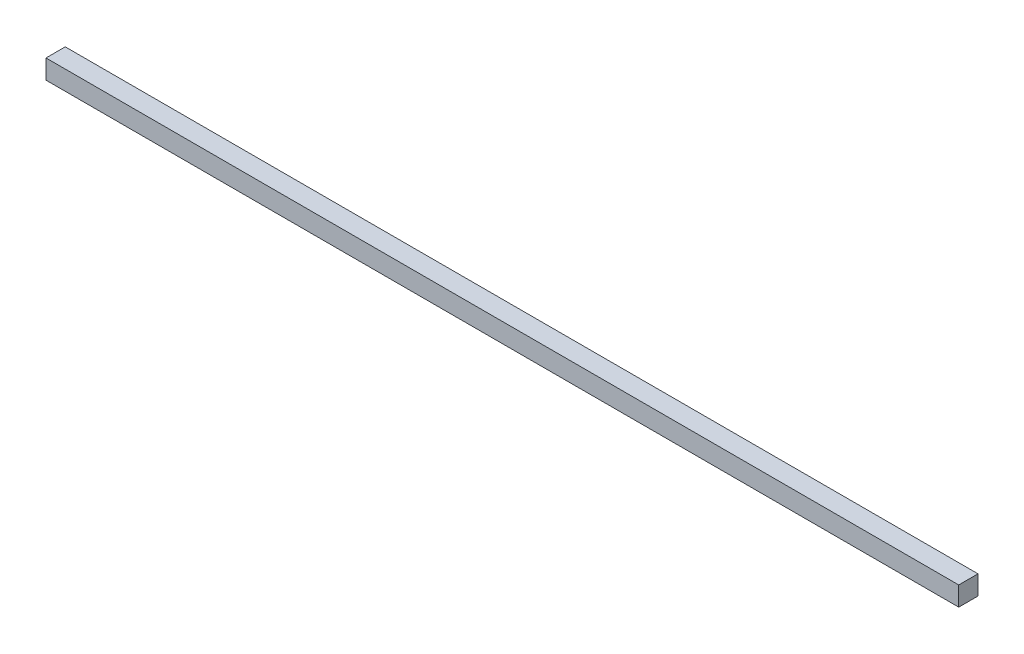
ISO-10303-21;
HEADER;
FILE_DESCRIPTION(('STEP AP214'),'2;1');
FILE_NAME('part.step','',(''),(''),'','','');
FILE_SCHEMA(('AUTOMOTIVE_DESIGN { 1 0 10303 214 1 1 1 1 }'));
ENDSEC;
DATA;
#1=APPLICATION_CONTEXT('core data for automotive mechanical design processes');
#2=APPLICATION_PROTOCOL_DEFINITION('international standard','automotive_design',2000,#1);
#3=PRODUCT_CONTEXT('',#1,'mechanical');
#4=PRODUCT('Part','Part','',(#3));
#5=PRODUCT_RELATED_PRODUCT_CATEGORY('part','',(#4));
#6=PRODUCT_DEFINITION_FORMATION('','',#4);
#7=PRODUCT_DEFINITION_CONTEXT('part definition',#1,'design');
#8=PRODUCT_DEFINITION('design','',#6,#7);
#9=PRODUCT_DEFINITION_SHAPE('','',#8);
#10=(LENGTH_UNIT() NAMED_UNIT(*) SI_UNIT(.MILLI.,.METRE.));
#11=(NAMED_UNIT(*) PLANE_ANGLE_UNIT() SI_UNIT($,.RADIAN.));
#12=(NAMED_UNIT(*) SI_UNIT($,.STERADIAN.) SOLID_ANGLE_UNIT());
#13=UNCERTAINTY_MEASURE_WITH_UNIT(LENGTH_MEASURE(1.E-05),#10,'distance_accuracy_value','');
#14=(GEOMETRIC_REPRESENTATION_CONTEXT(3) GLOBAL_UNCERTAINTY_ASSIGNED_CONTEXT((#13)) GLOBAL_UNIT_ASSIGNED_CONTEXT((#10,
#11,#12)) REPRESENTATION_CONTEXT('',''));
#15=CARTESIAN_POINT('',(0.,0.,0.));
#16=DIRECTION('',(0.,0.,1.));
#17=DIRECTION('',(1.,0.,0.));
#18=AXIS2_PLACEMENT_3D('',#15,#16,#17);
#19=CARTESIAN_POINT('',(150.495,3.175,3.175));
#20=DIRECTION('',(0.,0.,-1.));
#21=DIRECTION('',(0.,-1.,0.));
#22=AXIS2_PLACEMENT_3D('',#19,#20,#21);
#23=PLANE('',#22);
#24=DIRECTION('',(0.,1.,0.));
#25=VECTOR('',#24,1.);
#26=CARTESIAN_POINT('',(-150.495,3.175,3.175));
#27=LINE('',#26,#25);
#28=CARTESIAN_POINT('',(-150.495,-3.175,3.175));
#29=VERTEX_POINT('',#28);
#30=CARTESIAN_POINT('',(-150.495,3.175,3.175));
#31=VERTEX_POINT('',#30);
#32=EDGE_CURVE('E108',#29,#31,#27,.T.);
#33=ORIENTED_EDGE('',*,*,#32,.F.);
#34=DIRECTION('',(-1.,0.,0.));
#35=VECTOR('',#34,1.);
#36=CARTESIAN_POINT('',(150.495,-3.175,3.175));
#37=LINE('',#36,#35);
#38=CARTESIAN_POINT('',(150.495,-3.175,3.175));
#39=VERTEX_POINT('',#38);
#40=EDGE_CURVE('E107',#39,#29,#37,.T.);
#41=ORIENTED_EDGE('',*,*,#40,.F.);
#42=DIRECTION('',(0.,1.,0.));
#43=VECTOR('',#42,1.);
#44=CARTESIAN_POINT('',(150.495,3.175,3.175));
#45=LINE('',#44,#43);
#46=CARTESIAN_POINT('',(150.495,3.175,3.175));
#47=VERTEX_POINT('',#46);
#48=EDGE_CURVE('E102',#39,#47,#45,.T.);
#49=ORIENTED_EDGE('',*,*,#48,.T.);
#50=DIRECTION('',(-1.,0.,0.));
#51=VECTOR('',#50,1.);
#52=CARTESIAN_POINT('',(150.495,3.175,3.175));
#53=LINE('',#52,#51);
#54=EDGE_CURVE('E11',#47,#31,#53,.T.);
#55=ORIENTED_EDGE('',*,*,#54,.T.);
#56=EDGE_LOOP('',(#33,#41,#49,#55));
#57=FACE_BOUND('',#56,.T.);
#58=ADVANCED_FACE('F45',(#57),#23,.F.);
#59=CARTESIAN_POINT('',(150.495,3.175,-3.175));
#60=DIRECTION('',(0.,-1.,0.));
#61=DIRECTION('',(0.,0.,1.));
#62=AXIS2_PLACEMENT_3D('',#59,#60,#61);
#63=PLANE('',#62);
#64=DIRECTION('',(0.,0.,-1.));
#65=VECTOR('',#64,1.);
#66=CARTESIAN_POINT('',(-150.495,3.175,-3.175));
#67=LINE('',#66,#65);
#68=CARTESIAN_POINT('',(-150.495,3.175,-3.175));
#69=VERTEX_POINT('',#68);
#70=EDGE_CURVE('E110',#31,#69,#67,.T.);
#71=ORIENTED_EDGE('',*,*,#70,.F.);
#72=ORIENTED_EDGE('',*,*,#54,.F.);
#73=DIRECTION('',(0.,0.,-1.));
#74=VECTOR('',#73,1.);
#75=CARTESIAN_POINT('',(150.495,3.175,-3.175));
#76=LINE('',#75,#74);
#77=CARTESIAN_POINT('',(150.495,3.175,-3.175));
#78=VERTEX_POINT('',#77);
#79=EDGE_CURVE('E86',#47,#78,#76,.T.);
#80=ORIENTED_EDGE('',*,*,#79,.T.);
#81=DIRECTION('',(-1.,0.,0.));
#82=VECTOR('',#81,1.);
#83=CARTESIAN_POINT('',(150.495,3.175,-3.175));
#84=LINE('',#83,#82);
#85=EDGE_CURVE('E53',#78,#69,#84,.T.);
#86=ORIENTED_EDGE('',*,*,#85,.T.);
#87=EDGE_LOOP('',(#71,#72,#80,#86));
#88=FACE_BOUND('',#87,.T.);
#89=ADVANCED_FACE('F100',(#88),#63,.F.);
#90=CARTESIAN_POINT('',(150.495,3.175,-3.175));
#91=DIRECTION('',(0.,0.,1.));
#92=DIRECTION('',(0.,1.,0.));
#93=AXIS2_PLACEMENT_3D('',#90,#91,#92);
#94=PLANE('',#93);
#95=DIRECTION('',(0.,-1.,0.));
#96=VECTOR('',#95,1.);
#97=CARTESIAN_POINT('',(-150.495,3.175,-3.175));
#98=LINE('',#97,#96);
#99=CARTESIAN_POINT('',(-150.495,-3.175,-3.175));
#100=VERTEX_POINT('',#99);
#101=EDGE_CURVE('E96',#69,#100,#98,.T.);
#102=ORIENTED_EDGE('',*,*,#101,.F.);
#103=ORIENTED_EDGE('',*,*,#85,.F.);
#104=DIRECTION('',(0.,-1.,0.));
#105=VECTOR('',#104,1.);
#106=CARTESIAN_POINT('',(150.495,3.175,-3.175));
#107=LINE('',#106,#105);
#108=CARTESIAN_POINT('',(150.495,-3.175,-3.175));
#109=VERTEX_POINT('',#108);
#110=EDGE_CURVE('E89',#78,#109,#107,.T.);
#111=ORIENTED_EDGE('',*,*,#110,.T.);
#112=DIRECTION('',(-1.,0.,0.));
#113=VECTOR('',#112,1.);
#114=CARTESIAN_POINT('',(150.495,-3.175,-3.175));
#115=LINE('',#114,#113);
#116=EDGE_CURVE('E99',#109,#100,#115,.T.);
#117=ORIENTED_EDGE('',*,*,#116,.T.);
#118=EDGE_LOOP('',(#102,#103,#111,#117));
#119=FACE_BOUND('',#118,.T.);
#120=ADVANCED_FACE('F95',(#119),#94,.F.);
#121=CARTESIAN_POINT('',(150.495,-3.175,-3.175));
#122=DIRECTION('',(0.,1.,0.));
#123=DIRECTION('',(0.,0.,-1.));
#124=AXIS2_PLACEMENT_3D('',#121,#122,#123);
#125=PLANE('',#124);
#126=DIRECTION('',(0.,0.,1.));
#127=VECTOR('',#126,1.);
#128=CARTESIAN_POINT('',(-150.495,-3.175,-3.175));
#129=LINE('',#128,#127);
#130=EDGE_CURVE('E75',#100,#29,#129,.T.);
#131=ORIENTED_EDGE('',*,*,#130,.F.);
#132=ORIENTED_EDGE('',*,*,#116,.F.);
#133=DIRECTION('',(0.,0.,1.));
#134=VECTOR('',#133,1.);
#135=CARTESIAN_POINT('',(150.495,-3.175,-3.175));
#136=LINE('',#135,#134);
#137=EDGE_CURVE('E61',#109,#39,#136,.T.);
#138=ORIENTED_EDGE('',*,*,#137,.T.);
#139=ORIENTED_EDGE('',*,*,#40,.T.);
#140=EDGE_LOOP('',(#131,#132,#138,#139));
#141=FACE_BOUND('',#140,.T.);
#142=ADVANCED_FACE('F119',(#141),#125,.F.);
#143=CARTESIAN_POINT('',(150.495,0.,0.));
#144=DIRECTION('',(1.,0.,0.));
#145=DIRECTION('',(0.,0.,1.));
#146=AXIS2_PLACEMENT_3D('',#143,#144,#145);
#147=PLANE('',#146);
#148=ORIENTED_EDGE('',*,*,#48,.F.);
#149=ORIENTED_EDGE('',*,*,#137,.F.);
#150=ORIENTED_EDGE('',*,*,#110,.F.);
#151=ORIENTED_EDGE('',*,*,#79,.F.);
#152=EDGE_LOOP('',(#148,#149,#150,#151));
#153=FACE_BOUND('',#152,.T.);
#154=ADVANCED_FACE('F91',(#153),#147,.T.);
#155=CARTESIAN_POINT('',(-150.495,0.,0.));
#156=DIRECTION('',(1.,0.,0.));
#157=DIRECTION('',(0.,0.,1.));
#158=AXIS2_PLACEMENT_3D('',#155,#156,#157);
#159=PLANE('',#158);
#160=ORIENTED_EDGE('',*,*,#32,.T.);
#161=ORIENTED_EDGE('',*,*,#70,.T.);
#162=ORIENTED_EDGE('',*,*,#101,.T.);
#163=ORIENTED_EDGE('',*,*,#130,.T.);
#164=EDGE_LOOP('',(#160,#161,#162,#163));
#165=FACE_BOUND('',#164,.T.);
#166=ADVANCED_FACE('F115',(#165),#159,.F.);
#167=CLOSED_SHELL('',(#58,#89,#120,#142,#154,#166));
#168=MANIFOLD_SOLID_BREP('B2',#167);
#169=ADVANCED_BREP_SHAPE_REPRESENTATION('',(#18,#168),#14);
#170=SHAPE_DEFINITION_REPRESENTATION(#9,#169);
ENDSEC;
END-ISO-10303-21;
